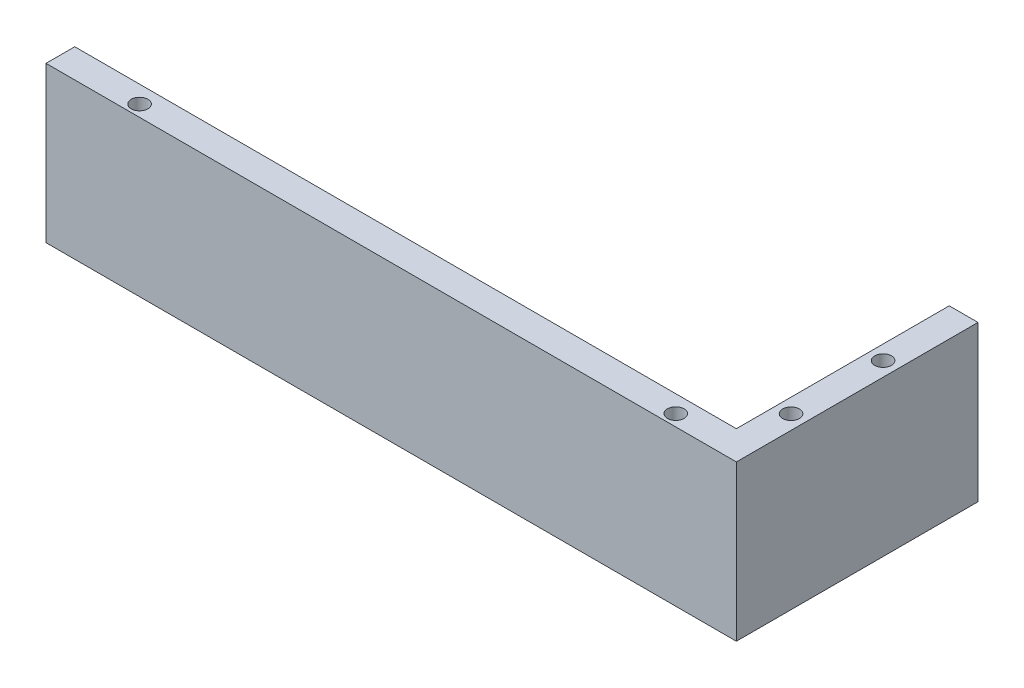
ISO-10303-21;
HEADER;
FILE_DESCRIPTION(('STEP AP214'),'2;1');
FILE_NAME('part.step','',(''),(''),'','','');
FILE_SCHEMA(('AUTOMOTIVE_DESIGN { 1 0 10303 214 1 1 1 1 }'));
ENDSEC;
DATA;
#1=APPLICATION_CONTEXT('core data for automotive mechanical design processes');
#2=APPLICATION_PROTOCOL_DEFINITION('international standard','automotive_design',2000,#1);
#3=PRODUCT_CONTEXT('',#1,'mechanical');
#4=PRODUCT('Part','Part','',(#3));
#5=PRODUCT_RELATED_PRODUCT_CATEGORY('part','',(#4));
#6=PRODUCT_DEFINITION_FORMATION('','',#4);
#7=PRODUCT_DEFINITION_CONTEXT('part definition',#1,'design');
#8=PRODUCT_DEFINITION('design','',#6,#7);
#9=PRODUCT_DEFINITION_SHAPE('','',#8);
#10=(LENGTH_UNIT() NAMED_UNIT(*) SI_UNIT(.MILLI.,.METRE.));
#11=(NAMED_UNIT(*) PLANE_ANGLE_UNIT() SI_UNIT($,.RADIAN.));
#12=(NAMED_UNIT(*) SI_UNIT($,.STERADIAN.) SOLID_ANGLE_UNIT());
#13=UNCERTAINTY_MEASURE_WITH_UNIT(LENGTH_MEASURE(1.E-05),#10,'distance_accuracy_value','');
#14=(GEOMETRIC_REPRESENTATION_CONTEXT(3) GLOBAL_UNCERTAINTY_ASSIGNED_CONTEXT((#13)) GLOBAL_UNIT_ASSIGNED_CONTEXT((#10,
#11,#12)) REPRESENTATION_CONTEXT('',''));
#15=CARTESIAN_POINT('',(0.,0.,0.));
#16=DIRECTION('',(0.,0.,1.));
#17=DIRECTION('',(1.,0.,0.));
#18=AXIS2_PLACEMENT_3D('',#15,#16,#17);
#19=CARTESIAN_POINT('',(-2.5,27.,0.));
#20=DIRECTION('',(-1.,0.,0.));
#21=DIRECTION('',(0.,0.,1.));
#22=AXIS2_PLACEMENT_3D('',#19,#20,#21);
#23=PLANE('',#22);
#24=DIRECTION('',(0.,0.,-1.));
#25=VECTOR('',#24,1.);
#26=CARTESIAN_POINT('',(-2.5,0.,0.));
#27=LINE('',#26,#25);
#28=CARTESIAN_POINT('',(-2.5,0.,17.));
#29=VERTEX_POINT('',#28);
#30=CARTESIAN_POINT('',(-2.5,0.,-20.));
#31=VERTEX_POINT('',#30);
#32=EDGE_CURVE('E150',#29,#31,#27,.T.);
#33=ORIENTED_EDGE('',*,*,#32,.F.);
#34=DIRECTION('',(0.,1.,0.));
#35=VECTOR('',#34,1.);
#36=CARTESIAN_POINT('',(-2.5,27.,17.));
#37=LINE('',#36,#35);
#38=CARTESIAN_POINT('',(-2.5,27.,17.));
#39=VERTEX_POINT('',#38);
#40=EDGE_CURVE('E111',#29,#39,#37,.T.);
#41=ORIENTED_EDGE('',*,*,#40,.T.);
#42=DIRECTION('',(0.,0.,-1.));
#43=VECTOR('',#42,1.);
#44=CARTESIAN_POINT('',(-2.5,27.,0.));
#45=LINE('',#44,#43);
#46=CARTESIAN_POINT('',(-2.5,27.,-20.));
#47=VERTEX_POINT('',#46);
#48=EDGE_CURVE('E56',#39,#47,#45,.T.);
#49=ORIENTED_EDGE('',*,*,#48,.T.);
#50=DIRECTION('',(0.,-1.,0.));
#51=VECTOR('',#50,1.);
#52=CARTESIAN_POINT('',(-2.5,27.,-20.));
#53=LINE('',#52,#51);
#54=EDGE_CURVE('E48',#47,#31,#53,.T.);
#55=ORIENTED_EDGE('',*,*,#54,.T.);
#56=EDGE_LOOP('',(#33,#41,#49,#55));
#57=FACE_BOUND('',#56,.T.);
#58=ADVANCED_FACE('F39',(#57),#23,.T.);
#59=CARTESIAN_POINT('',(2.5,27.,0.));
#60=DIRECTION('',(-1.,0.,0.));
#61=DIRECTION('',(0.,0.,1.));
#62=AXIS2_PLACEMENT_3D('',#59,#60,#61);
#63=PLANE('',#62);
#64=DIRECTION('',(0.,0.,-1.));
#65=VECTOR('',#64,1.);
#66=CARTESIAN_POINT('',(2.5,0.,0.));
#67=LINE('',#66,#65);
#68=CARTESIAN_POINT('',(2.5,0.,22.));
#69=VERTEX_POINT('',#68);
#70=CARTESIAN_POINT('',(2.5,0.,-20.));
#71=VERTEX_POINT('',#70);
#72=EDGE_CURVE('E68',#69,#71,#67,.T.);
#73=ORIENTED_EDGE('',*,*,#72,.T.);
#74=DIRECTION('',(0.,-1.,0.));
#75=VECTOR('',#74,1.);
#76=CARTESIAN_POINT('',(2.5,27.,-20.));
#77=LINE('',#76,#75);
#78=CARTESIAN_POINT('',(2.5,27.,-20.));
#79=VERTEX_POINT('',#78);
#80=EDGE_CURVE('E11',#79,#71,#77,.T.);
#81=ORIENTED_EDGE('',*,*,#80,.F.);
#82=DIRECTION('',(0.,0.,-1.));
#83=VECTOR('',#82,1.);
#84=CARTESIAN_POINT('',(2.5,27.,0.));
#85=LINE('',#84,#83);
#86=CARTESIAN_POINT('',(2.5,27.,22.));
#87=VERTEX_POINT('',#86);
#88=EDGE_CURVE('E141',#87,#79,#85,.T.);
#89=ORIENTED_EDGE('',*,*,#88,.F.);
#90=DIRECTION('',(0.,-1.,0.));
#91=VECTOR('',#90,1.);
#92=CARTESIAN_POINT('',(2.5,27.,22.));
#93=LINE('',#92,#91);
#94=EDGE_CURVE('E119',#87,#69,#93,.T.);
#95=ORIENTED_EDGE('',*,*,#94,.T.);
#96=EDGE_LOOP('',(#73,#81,#89,#95));
#97=FACE_BOUND('',#96,.T.);
#98=ADVANCED_FACE('F166',(#97),#63,.F.);
#99=CARTESIAN_POINT('',(0.,27.,10.));
#100=DIRECTION('',(0.,-1.,0.));
#101=DIRECTION('',(0.,0.,-1.));
#102=AXIS2_PLACEMENT_3D('',#99,#100,#101);
#103=CYLINDRICAL_SURFACE('',#102,1.45);
#104=CARTESIAN_POINT('',(0.,27.,10.));
#105=DIRECTION('',(0.,1.,0.));
#106=DIRECTION('',(0.,0.,1.));
#107=AXIS2_PLACEMENT_3D('',#104,#105,#106);
#108=CIRCLE('',#107,1.45);
#109=CARTESIAN_POINT('',(0.,27.,11.45));
#110=VERTEX_POINT('',#109);
#111=EDGE_CURVE('E136',#110,#110,#108,.T.);
#112=ORIENTED_EDGE('',*,*,#111,.T.);
#113=EDGE_LOOP('',(#112));
#114=FACE_BOUND('',#113,.T.);
#115=CARTESIAN_POINT('',(0.,0.,10.));
#116=DIRECTION('',(0.,1.,0.));
#117=DIRECTION('',(0.,0.,1.));
#118=AXIS2_PLACEMENT_3D('',#115,#116,#117);
#119=CIRCLE('',#118,1.45);
#120=CARTESIAN_POINT('',(0.,0.,11.45));
#121=VERTEX_POINT('',#120);
#122=EDGE_CURVE('E147',#121,#121,#119,.T.);
#123=ORIENTED_EDGE('',*,*,#122,.F.);
#124=EDGE_LOOP('',(#123));
#125=FACE_BOUND('',#124,.T.);
#126=ADVANCED_FACE('F168',(#114,#125),#103,.F.);
#127=CARTESIAN_POINT('',(0.,27.,-5.99999999999999));
#128=DIRECTION('',(0.,-1.,0.));
#129=DIRECTION('',(0.,0.,-1.));
#130=AXIS2_PLACEMENT_3D('',#127,#128,#129);
#131=CYLINDRICAL_SURFACE('',#130,1.45);
#132=CARTESIAN_POINT('',(0.,27.,-5.99999999999999));
#133=DIRECTION('',(0.,1.,0.));
#134=DIRECTION('',(0.,0.,1.));
#135=AXIS2_PLACEMENT_3D('',#132,#133,#134);
#136=CIRCLE('',#135,1.45);
#137=CARTESIAN_POINT('',(0.,27.,-4.54999999999999));
#138=VERTEX_POINT('',#137);
#139=EDGE_CURVE('E133',#138,#138,#136,.T.);
#140=ORIENTED_EDGE('',*,*,#139,.T.);
#141=EDGE_LOOP('',(#140));
#142=FACE_BOUND('',#141,.T.);
#143=CARTESIAN_POINT('',(0.,0.,-5.99999999999999));
#144=DIRECTION('',(0.,1.,0.));
#145=DIRECTION('',(0.,0.,1.));
#146=AXIS2_PLACEMENT_3D('',#143,#144,#145);
#147=CIRCLE('',#146,1.45);
#148=CARTESIAN_POINT('',(0.,0.,-4.54999999999999));
#149=VERTEX_POINT('',#148);
#150=EDGE_CURVE('E132',#149,#149,#147,.T.);
#151=ORIENTED_EDGE('',*,*,#150,.F.);
#152=EDGE_LOOP('',(#151));
#153=FACE_BOUND('',#152,.T.);
#154=ADVANCED_FACE('F41',(#142,#153),#131,.F.);
#155=CARTESIAN_POINT('',(0.,27.,-20.));
#156=DIRECTION('',(0.,0.,1.));
#157=DIRECTION('',(1.,0.,0.));
#158=AXIS2_PLACEMENT_3D('',#155,#156,#157);
#159=PLANE('',#158);
#160=DIRECTION('',(-1.,0.,0.));
#161=VECTOR('',#160,1.);
#162=CARTESIAN_POINT('',(0.,0.,-20.));
#163=LINE('',#162,#161);
#164=EDGE_CURVE('E137',#71,#31,#163,.T.);
#165=ORIENTED_EDGE('',*,*,#164,.T.);
#166=ORIENTED_EDGE('',*,*,#54,.F.);
#167=DIRECTION('',(-1.,0.,0.));
#168=VECTOR('',#167,1.);
#169=CARTESIAN_POINT('',(0.,27.,-20.));
#170=LINE('',#169,#168);
#171=EDGE_CURVE('E143',#79,#47,#170,.T.);
#172=ORIENTED_EDGE('',*,*,#171,.F.);
#173=ORIENTED_EDGE('',*,*,#80,.T.);
#174=EDGE_LOOP('',(#165,#166,#172,#173));
#175=FACE_BOUND('',#174,.T.);
#176=ADVANCED_FACE('F158',(#175),#159,.F.);
#177=CARTESIAN_POINT('',(0.,27.,0.));
#178=DIRECTION('',(0.,1.,0.));
#179=DIRECTION('',(0.,0.,1.));
#180=AXIS2_PLACEMENT_3D('',#177,#178,#179);
#181=PLANE('',#180);
#182=ORIENTED_EDGE('',*,*,#48,.F.);
#183=DIRECTION('',(-1.,0.,0.));
#184=VECTOR('',#183,1.);
#185=CARTESIAN_POINT('',(2.5,27.,17.));
#186=LINE('',#185,#184);
#187=CARTESIAN_POINT('',(-117.5,27.,17.));
#188=VERTEX_POINT('',#187);
#189=EDGE_CURVE('E77',#39,#188,#186,.T.);
#190=ORIENTED_EDGE('',*,*,#189,.T.);
#191=DIRECTION('',(0.,0.,1.));
#192=VECTOR('',#191,1.);
#193=CARTESIAN_POINT('',(-117.5,27.,22.));
#194=LINE('',#193,#192);
#195=CARTESIAN_POINT('',(-117.5,27.,22.));
#196=VERTEX_POINT('',#195);
#197=EDGE_CURVE('E100',#188,#196,#194,.T.);
#198=ORIENTED_EDGE('',*,*,#197,.T.);
#199=DIRECTION('',(1.,0.,0.));
#200=VECTOR('',#199,1.);
#201=CARTESIAN_POINT('',(2.5,27.,22.));
#202=LINE('',#201,#200);
#203=EDGE_CURVE('E117',#196,#87,#202,.T.);
#204=ORIENTED_EDGE('',*,*,#203,.T.);
#205=ORIENTED_EDGE('',*,*,#88,.T.);
#206=ORIENTED_EDGE('',*,*,#171,.T.);
#207=EDGE_LOOP('',(#182,#190,#198,#204,#205,#206));
#208=FACE_BOUND('',#207,.T.);
#209=ORIENTED_EDGE('',*,*,#139,.F.);
#210=EDGE_LOOP('',(#209));
#211=FACE_BOUND('',#210,.T.);
#212=ORIENTED_EDGE('',*,*,#111,.F.);
#213=EDGE_LOOP('',(#212));
#214=FACE_BOUND('',#213,.T.);
#215=CARTESIAN_POINT('',(-103.24,27.,20.));
#216=DIRECTION('',(0.,1.,0.));
#217=DIRECTION('',(0.,0.,1.));
#218=AXIS2_PLACEMENT_3D('',#215,#216,#217);
#219=CIRCLE('',#218,1.45);
#220=CARTESIAN_POINT('',(-103.24,27.,21.45));
#221=VERTEX_POINT('',#220);
#222=EDGE_CURVE('E125',#221,#221,#219,.T.);
#223=ORIENTED_EDGE('',*,*,#222,.F.);
#224=EDGE_LOOP('',(#223));
#225=FACE_BOUND('',#224,.T.);
#226=CARTESIAN_POINT('',(-10.04,27.,20.));
#227=DIRECTION('',(0.,1.,0.));
#228=DIRECTION('',(0.,0.,1.));
#229=AXIS2_PLACEMENT_3D('',#226,#227,#228);
#230=CIRCLE('',#229,1.45);
#231=CARTESIAN_POINT('',(-10.04,27.,21.45));
#232=VERTEX_POINT('',#231);
#233=EDGE_CURVE('E201',#232,#232,#230,.T.);
#234=ORIENTED_EDGE('',*,*,#233,.F.);
#235=EDGE_LOOP('',(#234));
#236=FACE_BOUND('',#235,.T.);
#237=ADVANCED_FACE('F96',(#208,#211,#214,#225,#236),#181,.T.);
#238=CARTESIAN_POINT('',(0.,0.,0.));
#239=DIRECTION('',(0.,1.,0.));
#240=DIRECTION('',(0.,0.,1.));
#241=AXIS2_PLACEMENT_3D('',#238,#239,#240);
#242=PLANE('',#241);
#243=DIRECTION('',(-1.,0.,0.));
#244=VECTOR('',#243,1.);
#245=CARTESIAN_POINT('',(2.5,0.,17.));
#246=LINE('',#245,#244);
#247=CARTESIAN_POINT('',(-117.5,0.,17.));
#248=VERTEX_POINT('',#247);
#249=EDGE_CURVE('E108',#29,#248,#246,.T.);
#250=ORIENTED_EDGE('',*,*,#249,.F.);
#251=ORIENTED_EDGE('',*,*,#32,.T.);
#252=ORIENTED_EDGE('',*,*,#164,.F.);
#253=ORIENTED_EDGE('',*,*,#72,.F.);
#254=DIRECTION('',(1.,0.,0.));
#255=VECTOR('',#254,1.);
#256=CARTESIAN_POINT('',(2.5,0.,22.));
#257=LINE('',#256,#255);
#258=CARTESIAN_POINT('',(-117.5,0.,22.));
#259=VERTEX_POINT('',#258);
#260=EDGE_CURVE('E102',#259,#69,#257,.T.);
#261=ORIENTED_EDGE('',*,*,#260,.F.);
#262=DIRECTION('',(0.,0.,1.));
#263=VECTOR('',#262,1.);
#264=CARTESIAN_POINT('',(-117.5,0.,22.));
#265=LINE('',#264,#263);
#266=EDGE_CURVE('E124',#248,#259,#265,.T.);
#267=ORIENTED_EDGE('',*,*,#266,.F.);
#268=EDGE_LOOP('',(#250,#251,#252,#253,#261,#267));
#269=FACE_BOUND('',#268,.T.);
#270=ORIENTED_EDGE('',*,*,#122,.T.);
#271=EDGE_LOOP('',(#270));
#272=FACE_BOUND('',#271,.T.);
#273=ORIENTED_EDGE('',*,*,#150,.T.);
#274=EDGE_LOOP('',(#273));
#275=FACE_BOUND('',#274,.T.);
#276=CARTESIAN_POINT('',(-103.24,0.,20.));
#277=DIRECTION('',(0.,1.,0.));
#278=DIRECTION('',(0.,0.,1.));
#279=AXIS2_PLACEMENT_3D('',#276,#277,#278);
#280=CIRCLE('',#279,1.45);
#281=CARTESIAN_POINT('',(-103.24,0.,21.45));
#282=VERTEX_POINT('',#281);
#283=EDGE_CURVE('E207',#282,#282,#280,.T.);
#284=ORIENTED_EDGE('',*,*,#283,.T.);
#285=EDGE_LOOP('',(#284));
#286=FACE_BOUND('',#285,.T.);
#287=CARTESIAN_POINT('',(-10.04,0.,20.));
#288=DIRECTION('',(0.,1.,0.));
#289=DIRECTION('',(0.,0.,1.));
#290=AXIS2_PLACEMENT_3D('',#287,#288,#289);
#291=CIRCLE('',#290,1.45);
#292=CARTESIAN_POINT('',(-10.04,0.,21.45));
#293=VERTEX_POINT('',#292);
#294=EDGE_CURVE('E204',#293,#293,#291,.T.);
#295=ORIENTED_EDGE('',*,*,#294,.T.);
#296=EDGE_LOOP('',(#295));
#297=FACE_BOUND('',#296,.T.);
#298=ADVANCED_FACE('F160',(#269,#272,#275,#286,#297),#242,.F.);
#299=CARTESIAN_POINT('',(2.5,27.,17.));
#300=DIRECTION('',(0.,0.,1.));
#301=DIRECTION('',(1.,0.,0.));
#302=AXIS2_PLACEMENT_3D('',#299,#300,#301);
#303=PLANE('',#302);
#304=ORIENTED_EDGE('',*,*,#40,.F.);
#305=ORIENTED_EDGE('',*,*,#249,.T.);
#306=DIRECTION('',(0.,-1.,0.));
#307=VECTOR('',#306,1.);
#308=CARTESIAN_POINT('',(-117.5,27.,17.));
#309=LINE('',#308,#307);
#310=EDGE_CURVE('E105',#188,#248,#309,.T.);
#311=ORIENTED_EDGE('',*,*,#310,.F.);
#312=ORIENTED_EDGE('',*,*,#189,.F.);
#313=EDGE_LOOP('',(#304,#305,#311,#312));
#314=FACE_BOUND('',#313,.T.);
#315=ADVANCED_FACE('F106',(#314),#303,.F.);
#316=CARTESIAN_POINT('',(-117.5,27.,22.));
#317=DIRECTION('',(1.,0.,0.));
#318=DIRECTION('',(0.,0.,-1.));
#319=AXIS2_PLACEMENT_3D('',#316,#317,#318);
#320=PLANE('',#319);
#321=ORIENTED_EDGE('',*,*,#266,.T.);
#322=DIRECTION('',(0.,-1.,0.));
#323=VECTOR('',#322,1.);
#324=CARTESIAN_POINT('',(-117.5,27.,22.));
#325=LINE('',#324,#323);
#326=EDGE_CURVE('E112',#196,#259,#325,.T.);
#327=ORIENTED_EDGE('',*,*,#326,.F.);
#328=ORIENTED_EDGE('',*,*,#197,.F.);
#329=ORIENTED_EDGE('',*,*,#310,.T.);
#330=EDGE_LOOP('',(#321,#327,#328,#329));
#331=FACE_BOUND('',#330,.T.);
#332=ADVANCED_FACE('F114',(#331),#320,.F.);
#333=CARTESIAN_POINT('',(2.5,27.,22.));
#334=DIRECTION('',(0.,0.,-1.));
#335=DIRECTION('',(-1.,0.,0.));
#336=AXIS2_PLACEMENT_3D('',#333,#334,#335);
#337=PLANE('',#336);
#338=ORIENTED_EDGE('',*,*,#260,.T.);
#339=ORIENTED_EDGE('',*,*,#94,.F.);
#340=ORIENTED_EDGE('',*,*,#203,.F.);
#341=ORIENTED_EDGE('',*,*,#326,.T.);
#342=EDGE_LOOP('',(#338,#339,#340,#341));
#343=FACE_BOUND('',#342,.T.);
#344=ADVANCED_FACE('F164',(#343),#337,.F.);
#345=CARTESIAN_POINT('',(-103.24,27.,20.));
#346=DIRECTION('',(0.,-1.,0.));
#347=DIRECTION('',(0.,0.,-1.));
#348=AXIS2_PLACEMENT_3D('',#345,#346,#347);
#349=CYLINDRICAL_SURFACE('',#348,1.45);
#350=ORIENTED_EDGE('',*,*,#222,.T.);
#351=EDGE_LOOP('',(#350));
#352=FACE_BOUND('',#351,.T.);
#353=ORIENTED_EDGE('',*,*,#283,.F.);
#354=EDGE_LOOP('',(#353));
#355=FACE_BOUND('',#354,.T.);
#356=ADVANCED_FACE('F189',(#352,#355),#349,.F.);
#357=CARTESIAN_POINT('',(-10.04,27.,20.));
#358=DIRECTION('',(0.,-1.,0.));
#359=DIRECTION('',(0.,0.,-1.));
#360=AXIS2_PLACEMENT_3D('',#357,#358,#359);
#361=CYLINDRICAL_SURFACE('',#360,1.45);
#362=ORIENTED_EDGE('',*,*,#233,.T.);
#363=EDGE_LOOP('',(#362));
#364=FACE_BOUND('',#363,.T.);
#365=ORIENTED_EDGE('',*,*,#294,.F.);
#366=EDGE_LOOP('',(#365));
#367=FACE_BOUND('',#366,.T.);
#368=ADVANCED_FACE('F192',(#364,#367),#361,.F.);
#369=CLOSED_SHELL('',(#58,#98,#126,#154,#176,#237,#298,#315,#332,#344,#356,#368));
#370=MANIFOLD_SOLID_BREP('B2',#369);
#371=ADVANCED_BREP_SHAPE_REPRESENTATION('',(#18,#370),#14);
#372=SHAPE_DEFINITION_REPRESENTATION(#9,#371);
ENDSEC;
END-ISO-10303-21;
